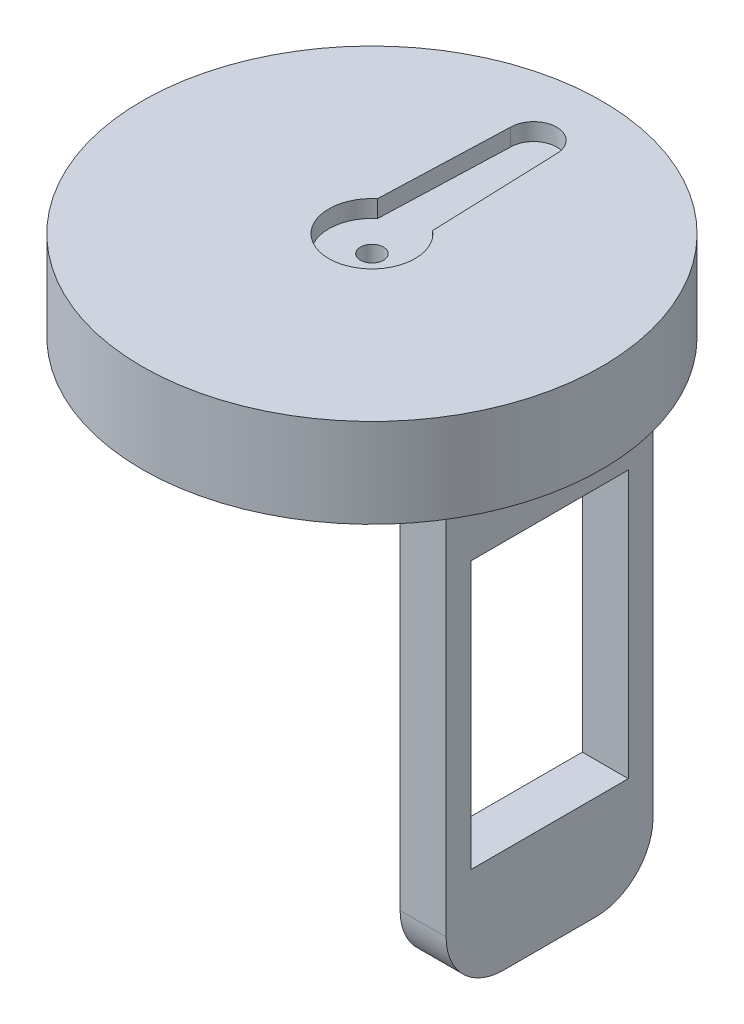
ISO-10303-21;
HEADER;
FILE_DESCRIPTION(('STEP AP214'),'2;1');
FILE_NAME('part.step','',(''),(''),'','','');
FILE_SCHEMA(('AUTOMOTIVE_DESIGN { 1 0 10303 214 1 1 1 1 }'));
ENDSEC;
DATA;
#1=APPLICATION_CONTEXT('core data for automotive mechanical design processes');
#2=APPLICATION_PROTOCOL_DEFINITION('international standard','automotive_design',2000,#1);
#3=PRODUCT_CONTEXT('',#1,'mechanical');
#4=PRODUCT('Part','Part','',(#3));
#5=PRODUCT_RELATED_PRODUCT_CATEGORY('part','',(#4));
#6=PRODUCT_DEFINITION_FORMATION('','',#4);
#7=PRODUCT_DEFINITION_CONTEXT('part definition',#1,'design');
#8=PRODUCT_DEFINITION('design','',#6,#7);
#9=PRODUCT_DEFINITION_SHAPE('','',#8);
#10=(LENGTH_UNIT() NAMED_UNIT(*) SI_UNIT(.MILLI.,.METRE.));
#11=(NAMED_UNIT(*) PLANE_ANGLE_UNIT() SI_UNIT($,.RADIAN.));
#12=(NAMED_UNIT(*) SI_UNIT($,.STERADIAN.) SOLID_ANGLE_UNIT());
#13=UNCERTAINTY_MEASURE_WITH_UNIT(LENGTH_MEASURE(1.E-05),#10,'distance_accuracy_value','');
#14=(GEOMETRIC_REPRESENTATION_CONTEXT(3) GLOBAL_UNCERTAINTY_ASSIGNED_CONTEXT((#13)) GLOBAL_UNIT_ASSIGNED_CONTEXT((#10,
#11,#12)) REPRESENTATION_CONTEXT('',''));
#15=CARTESIAN_POINT('',(0.,0.,0.));
#16=DIRECTION('',(0.,0.,1.));
#17=DIRECTION('',(1.,0.,0.));
#18=AXIS2_PLACEMENT_3D('',#15,#16,#17);
#19=CARTESIAN_POINT('',(0.,0.,0.));
#20=DIRECTION('',(0.,1.,0.));
#21=DIRECTION('',(0.,0.,1.));
#22=AXIS2_PLACEMENT_3D('',#19,#20,#21);
#23=PLANE('',#22);
#24=CARTESIAN_POINT('',(0.,0.,0.));
#25=DIRECTION('',(0.,1.,0.));
#26=DIRECTION('',(0.,0.,1.));
#27=AXIS2_PLACEMENT_3D('',#24,#25,#26);
#28=CIRCLE('',#27,20.);
#29=CARTESIAN_POINT('',(0.,0.,20.));
#30=VERTEX_POINT('',#29);
#31=EDGE_CURVE('E302',#30,#30,#28,.T.);
#32=ORIENTED_EDGE('',*,*,#31,.F.);
#33=EDGE_LOOP('',(#32));
#34=FACE_BOUND('',#33,.T.);
#35=DIRECTION('',(-1.,0.,0.));
#36=VECTOR('',#35,1.);
#37=CARTESIAN_POINT('',(15.45,0.,9.));
#38=LINE('',#37,#36);
#39=CARTESIAN_POINT('',(15.45,0.,9.));
#40=VERTEX_POINT('',#39);
#41=CARTESIAN_POINT('',(11.45,0.,9.));
#42=VERTEX_POINT('',#41);
#43=EDGE_CURVE('E221',#40,#42,#38,.T.);
#44=ORIENTED_EDGE('',*,*,#43,.F.);
#45=DIRECTION('',(0.,0.,1.));
#46=VECTOR('',#45,1.);
#47=CARTESIAN_POINT('',(15.45,0.,9.));
#48=LINE('',#47,#46);
#49=CARTESIAN_POINT('',(15.45,0.,-9.));
#50=VERTEX_POINT('',#49);
#51=EDGE_CURVE('E219',#50,#40,#48,.T.);
#52=ORIENTED_EDGE('',*,*,#51,.F.);
#53=DIRECTION('',(-1.,0.,0.));
#54=VECTOR('',#53,1.);
#55=CARTESIAN_POINT('',(15.45,0.,-9.));
#56=LINE('',#55,#54);
#57=CARTESIAN_POINT('',(11.45,0.,-9.));
#58=VERTEX_POINT('',#57);
#59=EDGE_CURVE('E236',#50,#58,#56,.T.);
#60=ORIENTED_EDGE('',*,*,#59,.T.);
#61=DIRECTION('',(0.,0.,1.));
#62=VECTOR('',#61,1.);
#63=CARTESIAN_POINT('',(11.45,0.,9.));
#64=LINE('',#63,#62);
#65=EDGE_CURVE('E212',#58,#42,#64,.T.);
#66=ORIENTED_EDGE('',*,*,#65,.T.);
#67=EDGE_LOOP('',(#44,#52,#60,#66));
#68=FACE_BOUND('',#67,.T.);
#69=ADVANCED_FACE('F48',(#34,#68),#23,.F.);
#70=CARTESIAN_POINT('',(0.,7.75,0.));
#71=DIRECTION('',(0.,1.,0.));
#72=DIRECTION('',(0.,0.,1.));
#73=AXIS2_PLACEMENT_3D('',#70,#71,#72);
#74=PLANE('',#73);
#75=CARTESIAN_POINT('',(0.,7.75,0.));
#76=DIRECTION('',(0.,1.,0.));
#77=DIRECTION('',(0.,0.,1.));
#78=AXIS2_PLACEMENT_3D('',#75,#76,#77);
#79=CIRCLE('',#78,3.75);
#80=CARTESIAN_POINT('',(-2.4,7.75,-2.88140590684478));
#81=VERTEX_POINT('',#80);
#82=CARTESIAN_POINT('',(2.4,7.75,-2.88140590684478));
#83=VERTEX_POINT('',#82);
#84=EDGE_CURVE('E253',#81,#83,#79,.T.);
#85=ORIENTED_EDGE('',*,*,#84,.F.);
#86=DIRECTION('',(-0.0357462019660411,0.,0.999360900298287));
#87=VECTOR('',#86,1.);
#88=CARTESIAN_POINT('',(-2.4,7.75,-2.88140590684478));
#89=LINE('',#88,#87);
#90=CARTESIAN_POINT('',(-2.,7.75,-14.0642543811826));
#91=VERTEX_POINT('',#90);
#92=EDGE_CURVE('E257',#91,#81,#89,.T.);
#93=ORIENTED_EDGE('',*,*,#92,.F.);
#94=CARTESIAN_POINT('',(0.,7.75,-14.0642543811826));
#95=DIRECTION('',(0.,1.,0.));
#96=DIRECTION('',(0.,0.,-1.));
#97=AXIS2_PLACEMENT_3D('',#94,#95,#96);
#98=CIRCLE('',#97,2.);
#99=CARTESIAN_POINT('',(2.,7.75,-14.0642543811826));
#100=VERTEX_POINT('',#99);
#101=EDGE_CURVE('E276',#100,#91,#98,.T.);
#102=ORIENTED_EDGE('',*,*,#101,.F.);
#103=DIRECTION('',(-0.0357462019660411,0.,-0.999360900298287));
#104=VECTOR('',#103,1.);
#105=CARTESIAN_POINT('',(2.,7.75,-14.0642543811826));
#106=LINE('',#105,#104);
#107=EDGE_CURVE('E274',#83,#100,#106,.T.);
#108=ORIENTED_EDGE('',*,*,#107,.F.);
#109=EDGE_LOOP('',(#85,#93,#102,#108));
#110=FACE_BOUND('',#109,.T.);
#111=CARTESIAN_POINT('',(0.,7.75,0.));
#112=DIRECTION('',(0.,1.,0.));
#113=DIRECTION('',(0.,0.,1.));
#114=AXIS2_PLACEMENT_3D('',#111,#112,#113);
#115=CIRCLE('',#114,20.);
#116=CARTESIAN_POINT('',(0.,7.75,20.));
#117=VERTEX_POINT('',#116);
#118=EDGE_CURVE('E304',#117,#117,#115,.T.);
#119=ORIENTED_EDGE('',*,*,#118,.T.);
#120=EDGE_LOOP('',(#119));
#121=FACE_BOUND('',#120,.T.);
#122=ADVANCED_FACE('F353',(#110,#121),#74,.T.);
#123=CARTESIAN_POINT('',(0.,7.75,0.));
#124=DIRECTION('',(0.,-1.,0.));
#125=DIRECTION('',(0.,0.,-1.));
#126=AXIS2_PLACEMENT_3D('',#123,#124,#125);
#127=CYLINDRICAL_SURFACE('',#126,20.);
#128=ORIENTED_EDGE('',*,*,#118,.F.);
#129=EDGE_LOOP('',(#128));
#130=FACE_BOUND('',#129,.T.);
#131=ORIENTED_EDGE('',*,*,#31,.T.);
#132=EDGE_LOOP('',(#131));
#133=FACE_BOUND('',#132,.T.);
#134=ADVANCED_FACE('F363',(#130,#133),#127,.T.);
#135=CARTESIAN_POINT('',(0.,6.25,0.));
#136=DIRECTION('',(0.,1.,0.));
#137=DIRECTION('',(0.,0.,1.));
#138=AXIS2_PLACEMENT_3D('',#135,#136,#137);
#139=CYLINDRICAL_SURFACE('',#138,3.75);
#140=ORIENTED_EDGE('',*,*,#84,.T.);
#141=DIRECTION('',(0.,1.,0.));
#142=VECTOR('',#141,1.);
#143=CARTESIAN_POINT('',(2.4,6.25,-2.88140590684478));
#144=LINE('',#143,#142);
#145=CARTESIAN_POINT('',(2.4,6.25,-2.88140590684478));
#146=VERTEX_POINT('',#145);
#147=EDGE_CURVE('E275',#146,#83,#144,.T.);
#148=ORIENTED_EDGE('',*,*,#147,.F.);
#149=CARTESIAN_POINT('',(0.,6.25,0.));
#150=DIRECTION('',(0.,1.,0.));
#151=DIRECTION('',(0.,0.,1.));
#152=AXIS2_PLACEMENT_3D('',#149,#150,#151);
#153=CIRCLE('',#152,3.75);
#154=CARTESIAN_POINT('',(-2.4,6.25,-2.88140590684478));
#155=VERTEX_POINT('',#154);
#156=EDGE_CURVE('E254',#155,#146,#153,.T.);
#157=ORIENTED_EDGE('',*,*,#156,.F.);
#158=DIRECTION('',(0.,1.,0.));
#159=VECTOR('',#158,1.);
#160=CARTESIAN_POINT('',(-2.4,6.25,-2.88140590684478));
#161=LINE('',#160,#159);
#162=EDGE_CURVE('E286',#155,#81,#161,.T.);
#163=ORIENTED_EDGE('',*,*,#162,.T.);
#164=EDGE_LOOP('',(#140,#148,#157,#163));
#165=FACE_BOUND('',#164,.T.);
#166=ADVANCED_FACE('F366',(#165),#139,.F.);
#167=CARTESIAN_POINT('',(-2.4,6.25,-2.88140590684478));
#168=DIRECTION('',(-0.999360900298287,0.,-0.0357462019660411));
#169=DIRECTION('',(-0.0357462019660411,0.,0.999360900298287));
#170=AXIS2_PLACEMENT_3D('',#167,#168,#169);
#171=PLANE('',#170);
#172=ORIENTED_EDGE('',*,*,#92,.T.);
#173=ORIENTED_EDGE('',*,*,#162,.F.);
#174=DIRECTION('',(-0.0357462019660411,0.,0.999360900298287));
#175=VECTOR('',#174,1.);
#176=CARTESIAN_POINT('',(-2.4,6.25,-2.88140590684478));
#177=LINE('',#176,#175);
#178=CARTESIAN_POINT('',(-2.,6.25,-14.0642543811826));
#179=VERTEX_POINT('',#178);
#180=EDGE_CURVE('E268',#179,#155,#177,.T.);
#181=ORIENTED_EDGE('',*,*,#180,.F.);
#182=DIRECTION('',(0.,1.,0.));
#183=VECTOR('',#182,1.);
#184=CARTESIAN_POINT('',(-2.,6.25,-14.0642543811826));
#185=LINE('',#184,#183);
#186=EDGE_CURVE('E290',#179,#91,#185,.T.);
#187=ORIENTED_EDGE('',*,*,#186,.T.);
#188=EDGE_LOOP('',(#172,#173,#181,#187));
#189=FACE_BOUND('',#188,.T.);
#190=ADVANCED_FACE('F432',(#189),#171,.F.);
#191=CARTESIAN_POINT('',(0.,6.25,-14.0642543811826));
#192=DIRECTION('',(0.,1.,0.));
#193=DIRECTION('',(0.,0.,1.));
#194=AXIS2_PLACEMENT_3D('',#191,#192,#193);
#195=CYLINDRICAL_SURFACE('',#194,2.);
#196=ORIENTED_EDGE('',*,*,#101,.T.);
#197=ORIENTED_EDGE('',*,*,#186,.F.);
#198=CARTESIAN_POINT('',(0.,6.25,-14.0642543811826));
#199=DIRECTION('',(0.,1.,0.));
#200=DIRECTION('',(0.,0.,-1.));
#201=AXIS2_PLACEMENT_3D('',#198,#199,#200);
#202=CIRCLE('',#201,2.);
#203=CARTESIAN_POINT('',(2.,6.25,-14.0642543811826));
#204=VERTEX_POINT('',#203);
#205=EDGE_CURVE('E262',#204,#179,#202,.T.);
#206=ORIENTED_EDGE('',*,*,#205,.F.);
#207=DIRECTION('',(0.,1.,0.));
#208=VECTOR('',#207,1.);
#209=CARTESIAN_POINT('',(2.,6.25,-14.0642543811826));
#210=LINE('',#209,#208);
#211=EDGE_CURVE('E291',#204,#100,#210,.T.);
#212=ORIENTED_EDGE('',*,*,#211,.T.);
#213=EDGE_LOOP('',(#196,#197,#206,#212));
#214=FACE_BOUND('',#213,.T.);
#215=ADVANCED_FACE('F440',(#214),#195,.F.);
#216=CARTESIAN_POINT('',(2.,6.25,-14.0642543811826));
#217=DIRECTION('',(0.999360900298287,0.,-0.0357462019660411));
#218=DIRECTION('',(-0.0357462019660411,0.,-0.999360900298287));
#219=AXIS2_PLACEMENT_3D('',#216,#217,#218);
#220=PLANE('',#219);
#221=ORIENTED_EDGE('',*,*,#107,.T.);
#222=ORIENTED_EDGE('',*,*,#211,.F.);
#223=DIRECTION('',(-0.0357462019660411,0.,-0.999360900298287));
#224=VECTOR('',#223,1.);
#225=CARTESIAN_POINT('',(2.,6.25,-14.0642543811826));
#226=LINE('',#225,#224);
#227=EDGE_CURVE('E259',#146,#204,#226,.T.);
#228=ORIENTED_EDGE('',*,*,#227,.F.);
#229=ORIENTED_EDGE('',*,*,#147,.T.);
#230=EDGE_LOOP('',(#221,#222,#228,#229));
#231=FACE_BOUND('',#230,.T.);
#232=ADVANCED_FACE('F435',(#231),#220,.F.);
#233=CARTESIAN_POINT('',(0.,6.25,0.));
#234=DIRECTION('',(0.,1.,0.));
#235=DIRECTION('',(0.,0.,1.));
#236=AXIS2_PLACEMENT_3D('',#233,#234,#235);
#237=PLANE('',#236);
#238=CARTESIAN_POINT('',(0.,6.25,0.));
#239=DIRECTION('',(0.,1.,0.));
#240=DIRECTION('',(0.,0.,1.));
#241=AXIS2_PLACEMENT_3D('',#238,#239,#240);
#242=CIRCLE('',#241,1.);
#243=CARTESIAN_POINT('',(0.,6.25,1.));
#244=VERTEX_POINT('',#243);
#245=EDGE_CURVE('E246',#244,#244,#242,.T.);
#246=ORIENTED_EDGE('',*,*,#245,.F.);
#247=EDGE_LOOP('',(#246));
#248=FACE_BOUND('',#247,.T.);
#249=ORIENTED_EDGE('',*,*,#156,.T.);
#250=ORIENTED_EDGE('',*,*,#227,.T.);
#251=ORIENTED_EDGE('',*,*,#205,.T.);
#252=ORIENTED_EDGE('',*,*,#180,.T.);
#253=EDGE_LOOP('',(#249,#250,#251,#252));
#254=FACE_BOUND('',#253,.T.);
#255=ADVANCED_FACE('F428',(#248,#254),#237,.T.);
#256=CARTESIAN_POINT('',(0.,4.75,0.));
#257=DIRECTION('',(0.,1.,0.));
#258=DIRECTION('',(0.,0.,1.));
#259=AXIS2_PLACEMENT_3D('',#256,#257,#258);
#260=CYLINDRICAL_SURFACE('',#259,1.);
#261=CARTESIAN_POINT('',(0.,4.75,0.));
#262=DIRECTION('',(0.,1.,0.));
#263=DIRECTION('',(0.,0.,1.));
#264=AXIS2_PLACEMENT_3D('',#261,#262,#263);
#265=CIRCLE('',#264,1.);
#266=CARTESIAN_POINT('',(0.,4.75,1.));
#267=VERTEX_POINT('',#266);
#268=EDGE_CURVE('E247',#267,#267,#265,.T.);
#269=ORIENTED_EDGE('',*,*,#268,.F.);
#270=EDGE_LOOP('',(#269));
#271=FACE_BOUND('',#270,.T.);
#272=ORIENTED_EDGE('',*,*,#245,.T.);
#273=EDGE_LOOP('',(#272));
#274=FACE_BOUND('',#273,.T.);
#275=ADVANCED_FACE('F424',(#271,#274),#260,.F.);
#276=CARTESIAN_POINT('',(0.,4.75,0.));
#277=DIRECTION('',(0.,1.,0.));
#278=DIRECTION('',(0.,0.,1.));
#279=AXIS2_PLACEMENT_3D('',#276,#277,#278);
#280=PLANE('',#279);
#281=ORIENTED_EDGE('',*,*,#268,.T.);
#282=EDGE_LOOP('',(#281));
#283=FACE_BOUND('',#282,.T.);
#284=ADVANCED_FACE('F408',(#283),#280,.T.);
#285=CARTESIAN_POINT('',(15.45,0.,0.));
#286=DIRECTION('',(1.,0.,0.));
#287=DIRECTION('',(0.,0.,-1.));
#288=AXIS2_PLACEMENT_3D('',#285,#286,#287);
#289=PLANE('',#288);
#290=DIRECTION('',(0.,0.,-1.));
#291=VECTOR('',#290,1.);
#292=CARTESIAN_POINT('',(15.45,-38.,8.99999999999999));
#293=LINE('',#292,#291);
#294=CARTESIAN_POINT('',(15.45,-38.,3.99999999999999));
#295=VERTEX_POINT('',#294);
#296=CARTESIAN_POINT('',(15.45,-38.,-4.));
#297=VERTEX_POINT('',#296);
#298=EDGE_CURVE('E213',#295,#297,#293,.T.);
#299=ORIENTED_EDGE('',*,*,#298,.T.);
#300=CARTESIAN_POINT('',(15.45,-33.,-4.));
#301=DIRECTION('',(1.,0.,0.));
#302=DIRECTION('',(0.,0.,-1.));
#303=AXIS2_PLACEMENT_3D('',#300,#301,#302);
#304=CIRCLE('',#303,5.);
#305=CARTESIAN_POINT('',(15.45,-33.,-9.00000000000001));
#306=VERTEX_POINT('',#305);
#307=EDGE_CURVE('E59',#297,#306,#304,.T.);
#308=ORIENTED_EDGE('',*,*,#307,.T.);
#309=DIRECTION('',(0.,1.,0.));
#310=VECTOR('',#309,1.);
#311=CARTESIAN_POINT('',(15.45,0.,-9.));
#312=LINE('',#311,#310);
#313=EDGE_CURVE('E220',#306,#50,#312,.T.);
#314=ORIENTED_EDGE('',*,*,#313,.T.);
#315=ORIENTED_EDGE('',*,*,#51,.T.);
#316=DIRECTION('',(0.,-1.,0.));
#317=VECTOR('',#316,1.);
#318=CARTESIAN_POINT('',(15.45,0.,9.));
#319=LINE('',#318,#317);
#320=CARTESIAN_POINT('',(15.45,-33.,8.99999999999999));
#321=VERTEX_POINT('',#320);
#322=EDGE_CURVE('E209',#40,#321,#319,.T.);
#323=ORIENTED_EDGE('',*,*,#322,.T.);
#324=CARTESIAN_POINT('',(15.45,-33.,3.99999999999999));
#325=DIRECTION('',(1.,0.,0.));
#326=DIRECTION('',(0.,0.,-1.));
#327=AXIS2_PLACEMENT_3D('',#324,#325,#326);
#328=CIRCLE('',#327,5.);
#329=EDGE_CURVE('E326',#321,#295,#328,.T.);
#330=ORIENTED_EDGE('',*,*,#329,.T.);
#331=EDGE_LOOP('',(#299,#308,#314,#315,#323,#330));
#332=FACE_BOUND('',#331,.T.);
#333=DIRECTION('',(0.,0.,-1.));
#334=VECTOR('',#333,1.);
#335=CARTESIAN_POINT('',(15.45,-29.,6.85));
#336=LINE('',#335,#334);
#337=CARTESIAN_POINT('',(15.45,-29.,6.85));
#338=VERTEX_POINT('',#337);
#339=CARTESIAN_POINT('',(15.45,-29.,-6.85));
#340=VERTEX_POINT('',#339);
#341=EDGE_CURVE('E164',#338,#340,#336,.T.);
#342=ORIENTED_EDGE('',*,*,#341,.F.);
#343=DIRECTION('',(0.,-1.,0.));
#344=VECTOR('',#343,1.);
#345=CARTESIAN_POINT('',(15.45,-5.75,6.85));
#346=LINE('',#345,#344);
#347=CARTESIAN_POINT('',(15.45,-5.75,6.85));
#348=VERTEX_POINT('',#347);
#349=EDGE_CURVE('E152',#348,#338,#346,.T.);
#350=ORIENTED_EDGE('',*,*,#349,.F.);
#351=DIRECTION('',(0.,0.,1.));
#352=VECTOR('',#351,1.);
#353=CARTESIAN_POINT('',(15.45,-5.75,6.85));
#354=LINE('',#353,#352);
#355=CARTESIAN_POINT('',(15.45,-5.75,-6.85));
#356=VERTEX_POINT('',#355);
#357=EDGE_CURVE('E184',#356,#348,#354,.T.);
#358=ORIENTED_EDGE('',*,*,#357,.F.);
#359=DIRECTION('',(0.,1.,0.));
#360=VECTOR('',#359,1.);
#361=CARTESIAN_POINT('',(15.45,-5.75,-6.85));
#362=LINE('',#361,#360);
#363=EDGE_CURVE('E180',#340,#356,#362,.T.);
#364=ORIENTED_EDGE('',*,*,#363,.F.);
#365=EDGE_LOOP('',(#342,#350,#358,#364));
#366=FACE_BOUND('',#365,.T.);
#367=ADVANCED_FACE('F179',(#332,#366),#289,.T.);
#368=CARTESIAN_POINT('',(11.45,0.,0.));
#369=DIRECTION('',(1.,0.,0.));
#370=DIRECTION('',(0.,0.,-1.));
#371=AXIS2_PLACEMENT_3D('',#368,#369,#370);
#372=PLANE('',#371);
#373=CARTESIAN_POINT('',(11.45,-30.85,0.));
#374=DIRECTION('',(-1.,0.,0.));
#375=DIRECTION('',(0.,0.,1.));
#376=AXIS2_PLACEMENT_3D('',#373,#374,#375);
#377=CIRCLE('',#376,0.5);
#378=CARTESIAN_POINT('',(11.45,-30.85,0.5));
#379=VERTEX_POINT('',#378);
#380=EDGE_CURVE('E645',#379,#379,#377,.T.);
#381=ORIENTED_EDGE('',*,*,#380,.F.);
#382=EDGE_LOOP('',(#381));
#383=FACE_BOUND('',#382,.T.);
#384=CARTESIAN_POINT('',(11.45,-3.25,0.));
#385=DIRECTION('',(-1.,0.,0.));
#386=DIRECTION('',(0.,0.,1.));
#387=AXIS2_PLACEMENT_3D('',#384,#385,#386);
#388=CIRCLE('',#387,0.5);
#389=CARTESIAN_POINT('',(11.45,-3.25,0.5));
#390=VERTEX_POINT('',#389);
#391=EDGE_CURVE('E642',#390,#390,#388,.T.);
#392=ORIENTED_EDGE('',*,*,#391,.F.);
#393=EDGE_LOOP('',(#392));
#394=FACE_BOUND('',#393,.T.);
#395=DIRECTION('',(0.,1.,0.));
#396=VECTOR('',#395,1.);
#397=CARTESIAN_POINT('',(11.45,0.,-9.));
#398=LINE('',#397,#396);
#399=CARTESIAN_POINT('',(11.45,-33.,-9.00000000000001));
#400=VERTEX_POINT('',#399);
#401=EDGE_CURVE('E226',#400,#58,#398,.T.);
#402=ORIENTED_EDGE('',*,*,#401,.F.);
#403=CARTESIAN_POINT('',(11.45,-33.,-4.));
#404=DIRECTION('',(1.,0.,0.));
#405=DIRECTION('',(0.,0.,-1.));
#406=AXIS2_PLACEMENT_3D('',#403,#404,#405);
#407=CIRCLE('',#406,5.);
#408=CARTESIAN_POINT('',(11.45,-38.,-4.));
#409=VERTEX_POINT('',#408);
#410=EDGE_CURVE('E320',#400,#409,#407,.F.);
#411=ORIENTED_EDGE('',*,*,#410,.T.);
#412=DIRECTION('',(0.,0.,-1.));
#413=VECTOR('',#412,1.);
#414=CARTESIAN_POINT('',(11.45,-38.,8.99999999999999));
#415=LINE('',#414,#413);
#416=CARTESIAN_POINT('',(11.45,-38.,3.99999999999999));
#417=VERTEX_POINT('',#416);
#418=EDGE_CURVE('E230',#417,#409,#415,.T.);
#419=ORIENTED_EDGE('',*,*,#418,.F.);
#420=CARTESIAN_POINT('',(11.45,-33.,3.99999999999999));
#421=DIRECTION('',(1.,0.,0.));
#422=DIRECTION('',(0.,0.,-1.));
#423=AXIS2_PLACEMENT_3D('',#420,#421,#422);
#424=CIRCLE('',#423,5.);
#425=CARTESIAN_POINT('',(11.45,-33.,8.99999999999999));
#426=VERTEX_POINT('',#425);
#427=EDGE_CURVE('E314',#417,#426,#424,.F.);
#428=ORIENTED_EDGE('',*,*,#427,.T.);
#429=DIRECTION('',(0.,-1.,0.));
#430=VECTOR('',#429,1.);
#431=CARTESIAN_POINT('',(11.45,0.,9.));
#432=LINE('',#431,#430);
#433=EDGE_CURVE('E174',#42,#426,#432,.T.);
#434=ORIENTED_EDGE('',*,*,#433,.F.);
#435=ORIENTED_EDGE('',*,*,#65,.F.);
#436=EDGE_LOOP('',(#402,#411,#419,#428,#434,#435));
#437=FACE_BOUND('',#436,.T.);
#438=DIRECTION('',(0.,-1.,0.));
#439=VECTOR('',#438,1.);
#440=CARTESIAN_POINT('',(11.45,-5.75,6.85));
#441=LINE('',#440,#439);
#442=CARTESIAN_POINT('',(11.45,-5.75,6.85));
#443=VERTEX_POINT('',#442);
#444=CARTESIAN_POINT('',(11.45,-29.,6.85));
#445=VERTEX_POINT('',#444);
#446=EDGE_CURVE('E186',#443,#445,#441,.T.);
#447=ORIENTED_EDGE('',*,*,#446,.T.);
#448=DIRECTION('',(0.,0.,-1.));
#449=VECTOR('',#448,1.);
#450=CARTESIAN_POINT('',(11.45,-29.,6.85));
#451=LINE('',#450,#449);
#452=CARTESIAN_POINT('',(11.45,-29.,-6.85));
#453=VERTEX_POINT('',#452);
#454=EDGE_CURVE('E175',#445,#453,#451,.T.);
#455=ORIENTED_EDGE('',*,*,#454,.T.);
#456=DIRECTION('',(0.,1.,0.));
#457=VECTOR('',#456,1.);
#458=CARTESIAN_POINT('',(11.45,-5.75,-6.85));
#459=LINE('',#458,#457);
#460=CARTESIAN_POINT('',(11.45,-5.75,-6.85));
#461=VERTEX_POINT('',#460);
#462=EDGE_CURVE('E198',#453,#461,#459,.T.);
#463=ORIENTED_EDGE('',*,*,#462,.T.);
#464=DIRECTION('',(0.,0.,1.));
#465=VECTOR('',#464,1.);
#466=CARTESIAN_POINT('',(11.45,-5.75,6.85));
#467=LINE('',#466,#465);
#468=EDGE_CURVE('E167',#461,#443,#467,.T.);
#469=ORIENTED_EDGE('',*,*,#468,.T.);
#470=EDGE_LOOP('',(#447,#455,#463,#469));
#471=FACE_BOUND('',#470,.T.);
#472=ADVANCED_FACE('F342',(#383,#394,#437,#471),#372,.F.);
#473=CARTESIAN_POINT('',(15.45,0.,9.));
#474=DIRECTION('',(0.,0.,-1.));
#475=DIRECTION('',(0.,1.,0.));
#476=AXIS2_PLACEMENT_3D('',#473,#474,#475);
#477=PLANE('',#476);
#478=ORIENTED_EDGE('',*,*,#433,.T.);
#479=DIRECTION('',(-1.,0.,0.));
#480=VECTOR('',#479,1.);
#481=CARTESIAN_POINT('',(15.45,-33.,8.99999999999999));
#482=LINE('',#481,#480);
#483=EDGE_CURVE('E11',#426,#321,#482,.F.);
#484=ORIENTED_EDGE('',*,*,#483,.T.);
#485=ORIENTED_EDGE('',*,*,#322,.F.);
#486=ORIENTED_EDGE('',*,*,#43,.T.);
#487=EDGE_LOOP('',(#478,#484,#485,#486));
#488=FACE_BOUND('',#487,.T.);
#489=ADVANCED_FACE('F348',(#488),#477,.F.);
#490=CARTESIAN_POINT('',(15.45,-38.,8.99999999999999));
#491=DIRECTION('',(0.,1.,0.));
#492=DIRECTION('',(0.,0.,1.));
#493=AXIS2_PLACEMENT_3D('',#490,#491,#492);
#494=PLANE('',#493);
#495=ORIENTED_EDGE('',*,*,#418,.T.);
#496=DIRECTION('',(-1.,0.,0.));
#497=VECTOR('',#496,1.);
#498=CARTESIAN_POINT('',(15.45,-38.,-4.));
#499=LINE('',#498,#497);
#500=EDGE_CURVE('E72',#409,#297,#499,.F.);
#501=ORIENTED_EDGE('',*,*,#500,.T.);
#502=ORIENTED_EDGE('',*,*,#298,.F.);
#503=DIRECTION('',(-1.,0.,0.));
#504=VECTOR('',#503,1.);
#505=CARTESIAN_POINT('',(15.45,-38.,3.99999999999999));
#506=LINE('',#505,#504);
#507=EDGE_CURVE('E319',#295,#417,#506,.T.);
#508=ORIENTED_EDGE('',*,*,#507,.T.);
#509=EDGE_LOOP('',(#495,#501,#502,#508));
#510=FACE_BOUND('',#509,.T.);
#511=ADVANCED_FACE('F345',(#510),#494,.F.);
#512=CARTESIAN_POINT('',(15.45,0.,-9.));
#513=DIRECTION('',(0.,0.,1.));
#514=DIRECTION('',(0.,-1.,0.));
#515=AXIS2_PLACEMENT_3D('',#512,#513,#514);
#516=PLANE('',#515);
#517=ORIENTED_EDGE('',*,*,#313,.F.);
#518=DIRECTION('',(-1.,0.,0.));
#519=VECTOR('',#518,1.);
#520=CARTESIAN_POINT('',(15.45,-33.,-9.00000000000001));
#521=LINE('',#520,#519);
#522=EDGE_CURVE('E307',#306,#400,#521,.T.);
#523=ORIENTED_EDGE('',*,*,#522,.T.);
#524=ORIENTED_EDGE('',*,*,#401,.T.);
#525=ORIENTED_EDGE('',*,*,#59,.F.);
#526=EDGE_LOOP('',(#517,#523,#524,#525));
#527=FACE_BOUND('',#526,.T.);
#528=ADVANCED_FACE('F340',(#527),#516,.F.);
#529=CARTESIAN_POINT('',(15.45,-5.75,6.85));
#530=DIRECTION('',(0.,0.,-1.));
#531=DIRECTION('',(0.,1.,0.));
#532=AXIS2_PLACEMENT_3D('',#529,#530,#531);
#533=PLANE('',#532);
#534=ORIENTED_EDGE('',*,*,#446,.F.);
#535=DIRECTION('',(-1.,0.,0.));
#536=VECTOR('',#535,1.);
#537=CARTESIAN_POINT('',(15.45,-5.75,6.85));
#538=LINE('',#537,#536);
#539=EDGE_CURVE('E159',#348,#443,#538,.T.);
#540=ORIENTED_EDGE('',*,*,#539,.F.);
#541=ORIENTED_EDGE('',*,*,#349,.T.);
#542=DIRECTION('',(-1.,0.,0.));
#543=VECTOR('',#542,1.);
#544=CARTESIAN_POINT('',(15.45,-29.,6.85));
#545=LINE('',#544,#543);
#546=EDGE_CURVE('E160',#338,#445,#545,.T.);
#547=ORIENTED_EDGE('',*,*,#546,.T.);
#548=EDGE_LOOP('',(#534,#540,#541,#547));
#549=FACE_BOUND('',#548,.T.);
#550=ADVANCED_FACE('F156',(#549),#533,.T.);
#551=CARTESIAN_POINT('',(15.45,-29.,6.85));
#552=DIRECTION('',(0.,1.,0.));
#553=DIRECTION('',(0.,0.,1.));
#554=AXIS2_PLACEMENT_3D('',#551,#552,#553);
#555=PLANE('',#554);
#556=ORIENTED_EDGE('',*,*,#454,.F.);
#557=ORIENTED_EDGE('',*,*,#546,.F.);
#558=ORIENTED_EDGE('',*,*,#341,.T.);
#559=DIRECTION('',(-1.,0.,0.));
#560=VECTOR('',#559,1.);
#561=CARTESIAN_POINT('',(15.45,-29.,-6.85));
#562=LINE('',#561,#560);
#563=EDGE_CURVE('E171',#340,#453,#562,.T.);
#564=ORIENTED_EDGE('',*,*,#563,.T.);
#565=EDGE_LOOP('',(#556,#557,#558,#564));
#566=FACE_BOUND('',#565,.T.);
#567=ADVANCED_FACE('F166',(#566),#555,.T.);
#568=CARTESIAN_POINT('',(15.45,-5.75,-6.85));
#569=DIRECTION('',(0.,0.,1.));
#570=DIRECTION('',(0.,-1.,0.));
#571=AXIS2_PLACEMENT_3D('',#568,#569,#570);
#572=PLANE('',#571);
#573=ORIENTED_EDGE('',*,*,#462,.F.);
#574=ORIENTED_EDGE('',*,*,#563,.F.);
#575=ORIENTED_EDGE('',*,*,#363,.T.);
#576=DIRECTION('',(-1.,0.,0.));
#577=VECTOR('',#576,1.);
#578=CARTESIAN_POINT('',(15.45,-5.75,-6.85));
#579=LINE('',#578,#577);
#580=EDGE_CURVE('E202',#356,#461,#579,.T.);
#581=ORIENTED_EDGE('',*,*,#580,.T.);
#582=EDGE_LOOP('',(#573,#574,#575,#581));
#583=FACE_BOUND('',#582,.T.);
#584=ADVANCED_FACE('F398',(#583),#572,.T.);
#585=CARTESIAN_POINT('',(15.45,-5.75,6.85));
#586=DIRECTION('',(0.,-1.,0.));
#587=DIRECTION('',(0.,0.,-1.));
#588=AXIS2_PLACEMENT_3D('',#585,#586,#587);
#589=PLANE('',#588);
#590=ORIENTED_EDGE('',*,*,#468,.F.);
#591=ORIENTED_EDGE('',*,*,#580,.F.);
#592=ORIENTED_EDGE('',*,*,#357,.T.);
#593=ORIENTED_EDGE('',*,*,#539,.T.);
#594=EDGE_LOOP('',(#590,#591,#592,#593));
#595=FACE_BOUND('',#594,.T.);
#596=ADVANCED_FACE('F395',(#595),#589,.T.);
#597=CARTESIAN_POINT('',(14.45,-3.25,0.));
#598=DIRECTION('',(-1.,0.,0.));
#599=DIRECTION('',(0.,0.,1.));
#600=AXIS2_PLACEMENT_3D('',#597,#598,#599);
#601=CYLINDRICAL_SURFACE('',#600,0.5);
#602=CARTESIAN_POINT('',(14.45,-3.25,0.));
#603=DIRECTION('',(-1.,0.,0.));
#604=DIRECTION('',(0.,0.,1.));
#605=AXIS2_PLACEMENT_3D('',#602,#603,#604);
#606=CIRCLE('',#605,0.5);
#607=CARTESIAN_POINT('',(14.45,-3.25,0.5));
#608=VERTEX_POINT('',#607);
#609=EDGE_CURVE('E648',#608,#608,#606,.T.);
#610=ORIENTED_EDGE('',*,*,#609,.F.);
#611=EDGE_LOOP('',(#610));
#612=FACE_BOUND('',#611,.T.);
#613=ORIENTED_EDGE('',*,*,#391,.T.);
#614=EDGE_LOOP('',(#613));
#615=FACE_BOUND('',#614,.T.);
#616=ADVANCED_FACE('F386',(#612,#615),#601,.F.);
#617=CARTESIAN_POINT('',(14.45,-3.25,0.));
#618=DIRECTION('',(-1.,0.,0.));
#619=DIRECTION('',(0.,0.,1.));
#620=AXIS2_PLACEMENT_3D('',#617,#618,#619);
#621=PLANE('',#620);
#622=ORIENTED_EDGE('',*,*,#609,.T.);
#623=EDGE_LOOP('',(#622));
#624=FACE_BOUND('',#623,.T.);
#625=ADVANCED_FACE('F383',(#624),#621,.T.);
#626=CARTESIAN_POINT('',(14.45,-30.85,0.));
#627=DIRECTION('',(-1.,0.,0.));
#628=DIRECTION('',(0.,0.,1.));
#629=AXIS2_PLACEMENT_3D('',#626,#627,#628);
#630=CYLINDRICAL_SURFACE('',#629,0.5);
#631=CARTESIAN_POINT('',(14.45,-30.85,0.));
#632=DIRECTION('',(-1.,0.,0.));
#633=DIRECTION('',(0.,0.,1.));
#634=AXIS2_PLACEMENT_3D('',#631,#632,#633);
#635=CIRCLE('',#634,0.5);
#636=CARTESIAN_POINT('',(14.45,-30.85,0.5));
#637=VERTEX_POINT('',#636);
#638=EDGE_CURVE('E194',#637,#637,#635,.T.);
#639=ORIENTED_EDGE('',*,*,#638,.F.);
#640=EDGE_LOOP('',(#639));
#641=FACE_BOUND('',#640,.T.);
#642=ORIENTED_EDGE('',*,*,#380,.T.);
#643=EDGE_LOOP('',(#642));
#644=FACE_BOUND('',#643,.T.);
#645=ADVANCED_FACE('F380',(#641,#644),#630,.F.);
#646=CARTESIAN_POINT('',(14.45,-30.85,0.));
#647=DIRECTION('',(-1.,0.,0.));
#648=DIRECTION('',(0.,0.,1.));
#649=AXIS2_PLACEMENT_3D('',#646,#647,#648);
#650=PLANE('',#649);
#651=ORIENTED_EDGE('',*,*,#638,.T.);
#652=EDGE_LOOP('',(#651));
#653=FACE_BOUND('',#652,.T.);
#654=ADVANCED_FACE('F371',(#653),#650,.T.);
#655=CARTESIAN_POINT('',(15.45,-33.,-4.));
#656=DIRECTION('',(-1.,0.,0.));
#657=DIRECTION('',(0.,0.,1.));
#658=AXIS2_PLACEMENT_3D('',#655,#656,#657);
#659=CYLINDRICAL_SURFACE('',#658,5.);
#660=ORIENTED_EDGE('',*,*,#307,.F.);
#661=ORIENTED_EDGE('',*,*,#500,.F.);
#662=ORIENTED_EDGE('',*,*,#410,.F.);
#663=ORIENTED_EDGE('',*,*,#522,.F.);
#664=EDGE_LOOP('',(#660,#661,#662,#663));
#665=FACE_BOUND('',#664,.T.);
#666=ADVANCED_FACE('F339',(#665),#659,.T.);
#667=CARTESIAN_POINT('',(15.45,-33.,3.99999999999999));
#668=DIRECTION('',(-1.,0.,0.));
#669=DIRECTION('',(0.,0.,1.));
#670=AXIS2_PLACEMENT_3D('',#667,#668,#669);
#671=CYLINDRICAL_SURFACE('',#670,5.);
#672=ORIENTED_EDGE('',*,*,#329,.F.);
#673=ORIENTED_EDGE('',*,*,#483,.F.);
#674=ORIENTED_EDGE('',*,*,#427,.F.);
#675=ORIENTED_EDGE('',*,*,#507,.F.);
#676=EDGE_LOOP('',(#672,#673,#674,#675));
#677=FACE_BOUND('',#676,.T.);
#678=ADVANCED_FACE('F49',(#677),#671,.T.);
#679=CLOSED_SHELL('',(#69,#122,#134,#166,#190,#215,#232,#255,#275,#284,#367,#472,#489,#511,#528,
#550,#567,#584,#596,#616,#625,#645,#654,#666,#678));
#680=CARTESIAN_POINT('',(0.,2.,0.));
#681=DIRECTION('',(0.,-1.,0.));
#682=DIRECTION('',(0.,0.,-1.));
#683=AXIS2_PLACEMENT_3D('',#680,#681,#682);
#684=PLANE('',#683);
#685=CARTESIAN_POINT('',(0.,2.,0.));
#686=DIRECTION('',(0.,-1.,0.));
#687=DIRECTION('',(0.,0.,-1.));
#688=AXIS2_PLACEMENT_3D('',#685,#686,#687);
#689=CIRCLE('',#688,18.);
#690=CARTESIAN_POINT('',(0.,2.,-18.));
#691=VERTEX_POINT('',#690);
#692=EDGE_CURVE('E245',#691,#691,#689,.T.);
#693=ORIENTED_EDGE('',*,*,#692,.F.);
#694=EDGE_LOOP('',(#693));
#695=FACE_BOUND('',#694,.T.);
#696=ADVANCED_FACE('F417',(#695),#684,.F.);
#697=CARTESIAN_POINT('',(0.,3.75,0.));
#698=DIRECTION('',(0.,1.,0.));
#699=DIRECTION('',(0.,0.,1.));
#700=AXIS2_PLACEMENT_3D('',#697,#698,#699);
#701=PLANE('',#700);
#702=CARTESIAN_POINT('',(0.,3.75,0.));
#703=DIRECTION('',(0.,1.,0.));
#704=DIRECTION('',(0.,0.,1.));
#705=AXIS2_PLACEMENT_3D('',#702,#703,#704);
#706=CIRCLE('',#705,18.);
#707=CARTESIAN_POINT('',(0.,3.75,18.));
#708=VERTEX_POINT('',#707);
#709=EDGE_CURVE('E288',#708,#708,#706,.T.);
#710=ORIENTED_EDGE('',*,*,#709,.F.);
#711=EDGE_LOOP('',(#710));
#712=FACE_BOUND('',#711,.T.);
#713=ADVANCED_FACE('F419',(#712),#701,.F.);
#714=CARTESIAN_POINT('',(0.,7.75,0.));
#715=DIRECTION('',(0.,-1.,0.));
#716=DIRECTION('',(0.,0.,-1.));
#717=AXIS2_PLACEMENT_3D('',#714,#715,#716);
#718=CYLINDRICAL_SURFACE('',#717,18.);
#719=ORIENTED_EDGE('',*,*,#709,.T.);
#720=EDGE_LOOP('',(#719));
#721=FACE_BOUND('',#720,.T.);
#722=ORIENTED_EDGE('',*,*,#692,.T.);
#723=EDGE_LOOP('',(#722));
#724=FACE_BOUND('',#723,.T.);
#725=ADVANCED_FACE('F449',(#721,#724),#718,.F.);
#726=CLOSED_SHELL('',(#696,#713,#725));
#727=ORIENTED_CLOSED_SHELL('',*,#726,.T.);
#728=BREP_WITH_VOIDS('B2',#679,(#727));
#729=ADVANCED_BREP_SHAPE_REPRESENTATION('',(#18,#728),#14);
#730=SHAPE_DEFINITION_REPRESENTATION(#9,#729);
ENDSEC;
END-ISO-10303-21;
